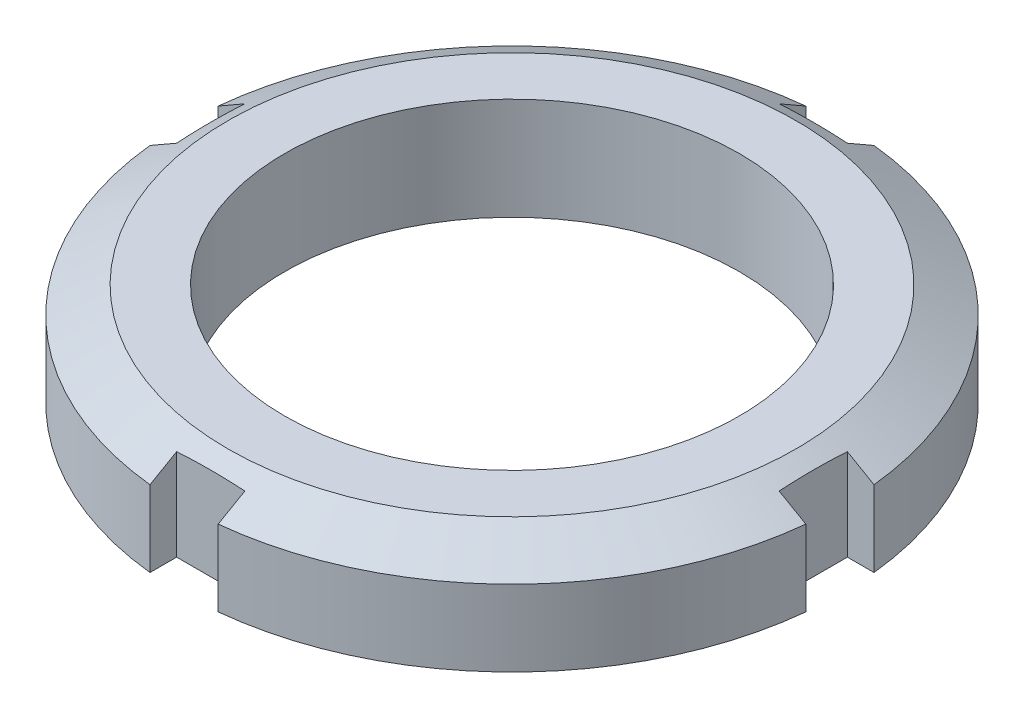
ISO-10303-21;
HEADER;
FILE_DESCRIPTION(('STEP AP214'),'2;1');
FILE_NAME('part.step','',(''),(''),'','','');
FILE_SCHEMA(('AUTOMOTIVE_DESIGN { 1 0 10303 214 1 1 1 1 }'));
ENDSEC;
DATA;
#1=APPLICATION_CONTEXT('core data for automotive mechanical design processes');
#2=APPLICATION_PROTOCOL_DEFINITION('international standard','automotive_design',2000,#1);
#3=PRODUCT_CONTEXT('',#1,'mechanical');
#4=PRODUCT('Part','Part','',(#3));
#5=PRODUCT_RELATED_PRODUCT_CATEGORY('part','',(#4));
#6=PRODUCT_DEFINITION_FORMATION('','',#4);
#7=PRODUCT_DEFINITION_CONTEXT('part definition',#1,'design');
#8=PRODUCT_DEFINITION('design','',#6,#7);
#9=PRODUCT_DEFINITION_SHAPE('','',#8);
#10=(LENGTH_UNIT() NAMED_UNIT(*) SI_UNIT(.MILLI.,.METRE.));
#11=(NAMED_UNIT(*) PLANE_ANGLE_UNIT() SI_UNIT($,.RADIAN.));
#12=(NAMED_UNIT(*) SI_UNIT($,.STERADIAN.) SOLID_ANGLE_UNIT());
#13=UNCERTAINTY_MEASURE_WITH_UNIT(LENGTH_MEASURE(1.E-05),#10,'distance_accuracy_value','');
#14=(GEOMETRIC_REPRESENTATION_CONTEXT(3) GLOBAL_UNCERTAINTY_ASSIGNED_CONTEXT((#13)) GLOBAL_UNIT_ASSIGNED_CONTEXT((#10,
#11,#12)) REPRESENTATION_CONTEXT('',''));
#15=CARTESIAN_POINT('',(0.,0.,0.));
#16=DIRECTION('',(0.,0.,1.));
#17=DIRECTION('',(1.,0.,0.));
#18=AXIS2_PLACEMENT_3D('',#15,#16,#17);
#19=CARTESIAN_POINT('',(0.,9.,0.));
#20=DIRECTION('',(0.,-1.,0.));
#21=DIRECTION('',(0.,0.,-1.));
#22=AXIS2_PLACEMENT_3D('',#19,#20,#21);
#23=CYLINDRICAL_SURFACE('',#22,29.);
#24=DIRECTION('',(0.,-1.,0.));
#25=VECTOR('',#24,1.);
#26=CARTESIAN_POINT('',(-3.,9.,28.8444102037119));
#27=LINE('',#26,#25);
#28=CARTESIAN_POINT('',(-3.,6.69059892324153,28.8444102037119));
#29=VERTEX_POINT('',#28);
#30=CARTESIAN_POINT('',(-3.,0.,28.8444102037119));
#31=VERTEX_POINT('',#30);
#32=EDGE_CURVE('E177',#29,#31,#27,.T.);
#33=ORIENTED_EDGE('',*,*,#32,.F.);
#34=CARTESIAN_POINT('',(0.,6.69059892324153,0.));
#35=DIRECTION('',(0.,1.,0.));
#36=DIRECTION('',(0.,0.,1.));
#37=AXIS2_PLACEMENT_3D('',#34,#35,#36);
#38=CIRCLE('',#37,29.);
#39=CARTESIAN_POINT('',(-28.8444102037119,6.69059892324153,3.));
#40=VERTEX_POINT('',#39);
#41=EDGE_CURVE('E173',#40,#29,#38,.T.);
#42=ORIENTED_EDGE('',*,*,#41,.F.);
#43=DIRECTION('',(0.,-1.,0.));
#44=VECTOR('',#43,1.);
#45=CARTESIAN_POINT('',(-28.8444102037119,9.,3.));
#46=LINE('',#45,#44);
#47=CARTESIAN_POINT('',(-28.8444102037119,0.,3.));
#48=VERTEX_POINT('',#47);
#49=EDGE_CURVE('E392',#48,#40,#46,.F.);
#50=ORIENTED_EDGE('',*,*,#49,.F.);
#51=CARTESIAN_POINT('',(0.,0.,0.));
#52=DIRECTION('',(0.,1.,0.));
#53=DIRECTION('',(0.,0.,1.));
#54=AXIS2_PLACEMENT_3D('',#51,#52,#53);
#55=CIRCLE('',#54,29.);
#56=EDGE_CURVE('E224',#48,#31,#55,.T.);
#57=ORIENTED_EDGE('',*,*,#56,.T.);
#58=EDGE_LOOP('',(#33,#42,#50,#57));
#59=FACE_BOUND('',#58,.T.);
#60=ADVANCED_FACE('F35',(#59),#23,.T.);
#61=DIRECTION('',(0.,-1.,0.));
#62=VECTOR('',#61,1.);
#63=CARTESIAN_POINT('',(3.,9.,-28.8444102037119));
#64=LINE('',#63,#62);
#65=CARTESIAN_POINT('',(3.,6.69059892324153,-28.8444102037119));
#66=VERTEX_POINT('',#65);
#67=CARTESIAN_POINT('',(3.,0.,-28.8444102037119));
#68=VERTEX_POINT('',#67);
#69=EDGE_CURVE('E197',#66,#68,#64,.T.);
#70=ORIENTED_EDGE('',*,*,#69,.F.);
#71=CARTESIAN_POINT('',(28.8444102037119,6.69059892324153,-3.));
#72=VERTEX_POINT('',#71);
#73=EDGE_CURVE('E171',#72,#66,#38,.T.);
#74=ORIENTED_EDGE('',*,*,#73,.F.);
#75=DIRECTION('',(0.,-1.,0.));
#76=VECTOR('',#75,1.);
#77=CARTESIAN_POINT('',(28.8444102037119,9.,-3.));
#78=LINE('',#77,#76);
#79=CARTESIAN_POINT('',(28.8444102037119,0.,-3.));
#80=VERTEX_POINT('',#79);
#81=EDGE_CURVE('E239',#80,#72,#78,.F.);
#82=ORIENTED_EDGE('',*,*,#81,.F.);
#83=EDGE_CURVE('E221',#80,#68,#55,.T.);
#84=ORIENTED_EDGE('',*,*,#83,.T.);
#85=EDGE_LOOP('',(#70,#74,#82,#84));
#86=FACE_BOUND('',#85,.T.);
#87=ADVANCED_FACE('F236',(#86),#23,.T.);
#88=DIRECTION('',(0.,-1.,0.));
#89=VECTOR('',#88,1.);
#90=CARTESIAN_POINT('',(-28.8444102037119,9.,-3.));
#91=LINE('',#90,#89);
#92=CARTESIAN_POINT('',(-28.8444102037119,6.69059892324153,-3.));
#93=VERTEX_POINT('',#92);
#94=CARTESIAN_POINT('',(-28.8444102037119,0.,-3.));
#95=VERTEX_POINT('',#94);
#96=EDGE_CURVE('E61',#93,#95,#91,.T.);
#97=ORIENTED_EDGE('',*,*,#96,.F.);
#98=CARTESIAN_POINT('',(-3.,6.69059892324153,-28.8444102037119));
#99=VERTEX_POINT('',#98);
#100=EDGE_CURVE('E55',#99,#93,#38,.T.);
#101=ORIENTED_EDGE('',*,*,#100,.F.);
#102=DIRECTION('',(0.,-1.,0.));
#103=VECTOR('',#102,1.);
#104=CARTESIAN_POINT('',(-3.,9.,-28.8444102037119));
#105=LINE('',#104,#103);
#106=CARTESIAN_POINT('',(-3.,0.,-28.8444102037119));
#107=VERTEX_POINT('',#106);
#108=EDGE_CURVE('E200',#107,#99,#105,.F.);
#109=ORIENTED_EDGE('',*,*,#108,.F.);
#110=EDGE_CURVE('E48',#107,#95,#55,.T.);
#111=ORIENTED_EDGE('',*,*,#110,.T.);
#112=EDGE_LOOP('',(#97,#101,#109,#111));
#113=FACE_BOUND('',#112,.T.);
#114=ADVANCED_FACE('F374',(#113),#23,.T.);
#115=CARTESIAN_POINT('',(0.,9.,0.));
#116=DIRECTION('',(0.,1.,0.));
#117=DIRECTION('',(0.,0.,1.));
#118=AXIS2_PLACEMENT_3D('',#115,#116,#117);
#119=PLANE('',#118);
#120=CARTESIAN_POINT('',(0.,9.,0.));
#121=DIRECTION('',(0.,1.,0.));
#122=DIRECTION('',(0.,0.,1.));
#123=AXIS2_PLACEMENT_3D('',#120,#121,#122);
#124=CIRCLE('',#123,25.);
#125=CARTESIAN_POINT('',(0.,9.,25.));
#126=VERTEX_POINT('',#125);
#127=EDGE_CURVE('E170',#126,#126,#124,.T.);
#128=ORIENTED_EDGE('',*,*,#127,.T.);
#129=EDGE_LOOP('',(#128));
#130=FACE_BOUND('',#129,.T.);
#131=CARTESIAN_POINT('',(0.,9.,0.));
#132=DIRECTION('',(0.,1.,0.));
#133=DIRECTION('',(0.,0.,1.));
#134=AXIS2_PLACEMENT_3D('',#131,#132,#133);
#135=CIRCLE('',#134,20.);
#136=CARTESIAN_POINT('',(0.,9.,20.));
#137=VERTEX_POINT('',#136);
#138=EDGE_CURVE('E218',#137,#137,#135,.T.);
#139=ORIENTED_EDGE('',*,*,#138,.F.);
#140=EDGE_LOOP('',(#139));
#141=FACE_BOUND('',#140,.T.);
#142=ADVANCED_FACE('F385',(#130,#141),#119,.T.);
#143=CARTESIAN_POINT('',(0.,0.,0.));
#144=DIRECTION('',(0.,1.,0.));
#145=DIRECTION('',(0.,0.,1.));
#146=AXIS2_PLACEMENT_3D('',#143,#144,#145);
#147=PLANE('',#146);
#148=ORIENTED_EDGE('',*,*,#56,.F.);
#149=DIRECTION('',(-1.,0.,0.));
#150=VECTOR('',#149,1.);
#151=CARTESIAN_POINT('',(-26.5,0.,3.));
#152=LINE('',#151,#150);
#153=CARTESIAN_POINT('',(-26.5,0.,3.));
#154=VERTEX_POINT('',#153);
#155=EDGE_CURVE('E399',#154,#48,#152,.T.);
#156=ORIENTED_EDGE('',*,*,#155,.F.);
#157=DIRECTION('',(0.,0.,1.));
#158=VECTOR('',#157,1.);
#159=CARTESIAN_POINT('',(-26.5,0.,3.));
#160=LINE('',#159,#158);
#161=CARTESIAN_POINT('',(-26.5,0.,-3.));
#162=VERTEX_POINT('',#161);
#163=EDGE_CURVE('E394',#162,#154,#160,.T.);
#164=ORIENTED_EDGE('',*,*,#163,.F.);
#165=DIRECTION('',(1.,0.,0.));
#166=VECTOR('',#165,1.);
#167=CARTESIAN_POINT('',(-26.5,0.,-3.));
#168=LINE('',#167,#166);
#169=EDGE_CURVE('E405',#95,#162,#168,.T.);
#170=ORIENTED_EDGE('',*,*,#169,.F.);
#171=ORIENTED_EDGE('',*,*,#110,.F.);
#172=DIRECTION('',(0.,0.,-1.));
#173=VECTOR('',#172,1.);
#174=CARTESIAN_POINT('',(-3.,0.,-29.));
#175=LINE('',#174,#173);
#176=CARTESIAN_POINT('',(-3.,0.,-26.5));
#177=VERTEX_POINT('',#176);
#178=EDGE_CURVE('E206',#177,#107,#175,.T.);
#179=ORIENTED_EDGE('',*,*,#178,.F.);
#180=DIRECTION('',(-1.,0.,0.));
#181=VECTOR('',#180,1.);
#182=CARTESIAN_POINT('',(-3.,0.,-26.5));
#183=LINE('',#182,#181);
#184=CARTESIAN_POINT('',(3.,0.,-26.5));
#185=VERTEX_POINT('',#184);
#186=EDGE_CURVE('E212',#185,#177,#183,.T.);
#187=ORIENTED_EDGE('',*,*,#186,.F.);
#188=DIRECTION('',(0.,0.,1.));
#189=VECTOR('',#188,1.);
#190=CARTESIAN_POINT('',(3.,0.,-29.));
#191=LINE('',#190,#189);
#192=EDGE_CURVE('E203',#68,#185,#191,.T.);
#193=ORIENTED_EDGE('',*,*,#192,.F.);
#194=ORIENTED_EDGE('',*,*,#83,.F.);
#195=DIRECTION('',(1.,0.,0.));
#196=VECTOR('',#195,1.);
#197=CARTESIAN_POINT('',(26.5,0.,-3.));
#198=LINE('',#197,#196);
#199=CARTESIAN_POINT('',(26.5,0.,-3.));
#200=VERTEX_POINT('',#199);
#201=EDGE_CURVE('E413',#200,#80,#198,.T.);
#202=ORIENTED_EDGE('',*,*,#201,.F.);
#203=DIRECTION('',(0.,0.,-1.));
#204=VECTOR('',#203,1.);
#205=CARTESIAN_POINT('',(26.5,0.,-3.));
#206=LINE('',#205,#204);
#207=CARTESIAN_POINT('',(26.5,0.,3.));
#208=VERTEX_POINT('',#207);
#209=EDGE_CURVE('E410',#208,#200,#206,.T.);
#210=ORIENTED_EDGE('',*,*,#209,.F.);
#211=DIRECTION('',(-1.,0.,0.));
#212=VECTOR('',#211,1.);
#213=CARTESIAN_POINT('',(26.5,0.,3.));
#214=LINE('',#213,#212);
#215=CARTESIAN_POINT('',(28.8444102037119,0.,3.));
#216=VERTEX_POINT('',#215);
#217=EDGE_CURVE('E178',#216,#208,#214,.T.);
#218=ORIENTED_EDGE('',*,*,#217,.F.);
#219=CARTESIAN_POINT('',(3.,0.,28.8444102037119));
#220=VERTEX_POINT('',#219);
#221=EDGE_CURVE('E225',#220,#216,#55,.T.);
#222=ORIENTED_EDGE('',*,*,#221,.F.);
#223=DIRECTION('',(0.,0.,1.));
#224=VECTOR('',#223,1.);
#225=CARTESIAN_POINT('',(3.,0.,26.5));
#226=LINE('',#225,#224);
#227=CARTESIAN_POINT('',(3.,0.,26.5));
#228=VERTEX_POINT('',#227);
#229=EDGE_CURVE('E176',#228,#220,#226,.T.);
#230=ORIENTED_EDGE('',*,*,#229,.F.);
#231=DIRECTION('',(1.,0.,0.));
#232=VECTOR('',#231,1.);
#233=CARTESIAN_POINT('',(-3.,0.,26.5));
#234=LINE('',#233,#232);
#235=CARTESIAN_POINT('',(-3.,0.,26.5));
#236=VERTEX_POINT('',#235);
#237=EDGE_CURVE('E187',#236,#228,#234,.T.);
#238=ORIENTED_EDGE('',*,*,#237,.F.);
#239=DIRECTION('',(0.,0.,-1.));
#240=VECTOR('',#239,1.);
#241=CARTESIAN_POINT('',(-3.,0.,26.5));
#242=LINE('',#241,#240);
#243=EDGE_CURVE('E190',#31,#236,#242,.T.);
#244=ORIENTED_EDGE('',*,*,#243,.F.);
#245=EDGE_LOOP('',(#148,#156,#164,#170,#171,#179,#187,#193,#194,#202,#210,#218,#222,#230,#238,#244));
#246=FACE_BOUND('',#245,.T.);
#247=CARTESIAN_POINT('',(0.,0.,0.));
#248=DIRECTION('',(0.,1.,0.));
#249=DIRECTION('',(0.,0.,1.));
#250=AXIS2_PLACEMENT_3D('',#247,#248,#249);
#251=CIRCLE('',#250,20.);
#252=CARTESIAN_POINT('',(0.,0.,20.));
#253=VERTEX_POINT('',#252);
#254=EDGE_CURVE('E217',#253,#253,#251,.T.);
#255=ORIENTED_EDGE('',*,*,#254,.T.);
#256=EDGE_LOOP('',(#255));
#257=FACE_BOUND('',#256,.T.);
#258=ADVANCED_FACE('F244',(#246,#257),#147,.F.);
#259=DIRECTION('',(0.,-1.,0.));
#260=VECTOR('',#259,1.);
#261=CARTESIAN_POINT('',(28.8444102037119,9.,3.));
#262=LINE('',#261,#260);
#263=CARTESIAN_POINT('',(28.8444102037119,6.69059892324153,3.));
#264=VERTEX_POINT('',#263);
#265=EDGE_CURVE('E169',#264,#216,#262,.T.);
#266=ORIENTED_EDGE('',*,*,#265,.F.);
#267=CARTESIAN_POINT('',(3.,6.69059892324153,28.8444102037119));
#268=VERTEX_POINT('',#267);
#269=EDGE_CURVE('E154',#268,#264,#38,.T.);
#270=ORIENTED_EDGE('',*,*,#269,.F.);
#271=DIRECTION('',(0.,-1.,0.));
#272=VECTOR('',#271,1.);
#273=CARTESIAN_POINT('',(3.,9.,28.8444102037119));
#274=LINE('',#273,#272);
#275=EDGE_CURVE('E167',#220,#268,#274,.F.);
#276=ORIENTED_EDGE('',*,*,#275,.F.);
#277=ORIENTED_EDGE('',*,*,#221,.T.);
#278=EDGE_LOOP('',(#266,#270,#276,#277));
#279=FACE_BOUND('',#278,.T.);
#280=ADVANCED_FACE('F37',(#279),#23,.T.);
#281=CARTESIAN_POINT('',(0.,9.,0.));
#282=DIRECTION('',(0.,-1.,0.));
#283=DIRECTION('',(0.,0.,-1.));
#284=AXIS2_PLACEMENT_3D('',#281,#282,#283);
#285=CYLINDRICAL_SURFACE('',#284,20.);
#286=ORIENTED_EDGE('',*,*,#138,.T.);
#287=EDGE_LOOP('',(#286));
#288=FACE_BOUND('',#287,.T.);
#289=ORIENTED_EDGE('',*,*,#254,.F.);
#290=EDGE_LOOP('',(#289));
#291=FACE_BOUND('',#290,.T.);
#292=ADVANCED_FACE('F377',(#288,#291),#285,.F.);
#293=CARTESIAN_POINT('',(-3.,-0.000999999999999265,-29.));
#294=DIRECTION('',(-1.,0.,0.));
#295=DIRECTION('',(0.,0.,1.));
#296=AXIS2_PLACEMENT_3D('',#293,#294,#295);
#297=PLANE('',#296);
#298=ORIENTED_EDGE('',*,*,#108,.T.);
#299=CARTESIAN_POINT('',(-3.,3.92751956717149,-33.6523381762277));
#300=CARTESIAN_POINT('',(-3.,4.42131510398871,-32.7936596757044));
#301=CARTESIAN_POINT('',(-3.,4.91500534536485,-31.9349205971219));
#302=CARTESIAN_POINT('',(-3.,5.90209977080451,-30.2172782791755));
#303=CARTESIAN_POINT('',(-3.,6.39550395492437,-29.358375039844));
#304=CARTESIAN_POINT('',(-3.,7.38195104144227,-27.6403609748876));
#305=CARTESIAN_POINT('',(-3.,7.87499394380557,-26.7812501492428));
#306=CARTESIAN_POINT('',(-3.,8.8605876956878,-25.0627460857465));
#307=CARTESIAN_POINT('',(-3.,9.35313854510872,-24.2033528478388));
#308=CARTESIAN_POINT('',(-3.,9.84537790801721,-23.3437811206322));
#309=B_SPLINE_CURVE_WITH_KNOTS('',3,(#299,#300,#301,#302,#303,#304,#305,#306,#307,#308),
.UNSPECIFIED.,.F.,.F.,(4,2,2,2,4),(0.,2.97160988952772,5.9432191937294,8.91482878371123,
11.886438965506),.UNSPECIFIED.);
#310=CARTESIAN_POINT('',(-3.,8.03624610843134,-26.5));
#311=VERTEX_POINT('',#310);
#312=EDGE_CURVE('E252',#99,#311,#309,.T.);
#313=ORIENTED_EDGE('',*,*,#312,.T.);
#314=DIRECTION('',(0.,1.,0.));
#315=VECTOR('',#314,1.);
#316=CARTESIAN_POINT('',(-3.,-0.000999999999999265,-26.5));
#317=LINE('',#316,#315);
#318=EDGE_CURVE('E208',#177,#311,#317,.T.);
#319=ORIENTED_EDGE('',*,*,#318,.F.);
#320=ORIENTED_EDGE('',*,*,#178,.T.);
#321=EDGE_LOOP('',(#298,#313,#319,#320));
#322=FACE_BOUND('',#321,.T.);
#323=ADVANCED_FACE('F382',(#322),#297,.F.);
#324=CARTESIAN_POINT('',(3.,-0.000999999999999265,-29.));
#325=DIRECTION('',(1.,0.,0.));
#326=DIRECTION('',(0.,0.,-1.));
#327=AXIS2_PLACEMENT_3D('',#324,#325,#326);
#328=PLANE('',#327);
#329=DIRECTION('',(0.,1.,0.));
#330=VECTOR('',#329,1.);
#331=CARTESIAN_POINT('',(3.,-0.000999999999999265,-26.5));
#332=LINE('',#331,#330);
#333=CARTESIAN_POINT('',(3.,8.03624610843134,-26.5));
#334=VERTEX_POINT('',#333);
#335=EDGE_CURVE('E209',#185,#334,#332,.T.);
#336=ORIENTED_EDGE('',*,*,#335,.T.);
#337=CARTESIAN_POINT('',(3.,9.84537790801721,-23.3437811206322));
#338=CARTESIAN_POINT('',(3.,9.35313854510872,-24.2033528478388));
#339=CARTESIAN_POINT('',(3.,8.8605876956878,-25.0627460857465));
#340=CARTESIAN_POINT('',(3.,7.87499394380557,-26.7812501492428));
#341=CARTESIAN_POINT('',(3.,7.38195104144227,-27.6403609748876));
#342=CARTESIAN_POINT('',(3.,6.39550395492436,-29.358375039844));
#343=CARTESIAN_POINT('',(3.,5.90209977080451,-30.2172782791755));
#344=CARTESIAN_POINT('',(3.,4.91500534536485,-31.9349205971219));
#345=CARTESIAN_POINT('',(3.,4.42131510398871,-32.7936596757044));
#346=CARTESIAN_POINT('',(3.,3.92751956717148,-33.6523381762277));
#347=B_SPLINE_CURVE_WITH_KNOTS('',3,(#337,#338,#339,#340,#341,#342,#343,#344,#345,#346),
.UNSPECIFIED.,.F.,.F.,(4,2,2,2,4),(0.,2.97161018179478,5.94321977177662,8.91482907597829,
11.886438965506),.UNSPECIFIED.);
#348=EDGE_CURVE('E250',#334,#66,#347,.T.);
#349=ORIENTED_EDGE('',*,*,#348,.T.);
#350=ORIENTED_EDGE('',*,*,#69,.T.);
#351=ORIENTED_EDGE('',*,*,#192,.T.);
#352=EDGE_LOOP('',(#336,#349,#350,#351));
#353=FACE_BOUND('',#352,.T.);
#354=ADVANCED_FACE('F248',(#353),#328,.F.);
#355=CARTESIAN_POINT('',(-3.,-0.000999999999999265,-26.5));
#356=DIRECTION('',(0.,0.,1.));
#357=DIRECTION('',(1.,0.,0.));
#358=AXIS2_PLACEMENT_3D('',#355,#356,#357);
#359=PLANE('',#358);
#360=ORIENTED_EDGE('',*,*,#318,.T.);
#361=CARTESIAN_POINT('',(-14.9988367405271,5.85332154770774,-26.5));
#362=CARTESIAN_POINT('',(-13.9525970902678,6.15087384790108,-26.5));
#363=CARTESIAN_POINT('',(-12.8995558952418,6.42677860890727,-26.5));
#364=CARTESIAN_POINT('',(-10.7796243397786,6.92604365132795,-26.5));
#365=CARTESIAN_POINT('',(-9.71271678933867,7.14933048853316,-26.5));
#366=CARTESIAN_POINT('',(-8.11295270220856,7.43564768166331,-26.5));
#367=CARTESIAN_POINT('',(-7.58433694855219,7.52244079843687,-26.5));
#368=CARTESIAN_POINT('',(-6.52471239992944,7.6798168670045,-26.5));
#369=CARTESIAN_POINT('',(-5.99370373523887,7.75040069065528,-26.5));
#370=CARTESIAN_POINT('',(-4.92996679924756,7.87437186343035,-26.5));
#371=CARTESIAN_POINT('',(-4.39723961522318,7.92776850677642,-26.5));
#372=CARTESIAN_POINT('',(-3.33028813357606,8.01664309714429,-26.5));
#373=CARTESIAN_POINT('',(-2.79606384350218,8.05212113435418,-26.5));
#374=CARTESIAN_POINT('',(-1.72542093371849,8.10467854293642,-26.5));
#375=CARTESIAN_POINT('',(-1.18900012494798,8.12171354320107,-26.5));
#376=CARTESIAN_POINT('',(-0.115887682938948,8.13696278171401,-26.5));
#377=CARTESIAN_POINT('',(0.420803951357742,8.13517694584645,-26.5));
#378=CARTESIAN_POINT('',(1.49404888615119,8.11280755301326,-26.5));
#379=CARTESIAN_POINT('',(2.03060199944767,8.09221505592009,-26.5));
#380=CARTESIAN_POINT('',(3.10266863247498,8.03254604694341,-26.5));
#381=CARTESIAN_POINT('',(3.6381821628859,7.99346972597192,-26.5));
#382=CARTESIAN_POINT('',(4.71664286320863,7.89661635522389,-26.5));
#383=CARTESIAN_POINT('',(5.25956251301624,7.83853409720274,-26.5));
#384=CARTESIAN_POINT('',(6.34324274672697,7.70473374811867,-26.5));
#385=CARTESIAN_POINT('',(6.88400322146448,7.62901477656423,-26.5));
#386=CARTESIAN_POINT('',(7.96251181703648,7.46104856207199,-26.5));
#387=CARTESIAN_POINT('',(8.50026192711688,7.36881401718704,-26.5));
#388=CARTESIAN_POINT('',(9.57281427352446,7.1689603802395,-26.5));
#389=CARTESIAN_POINT('',(10.1076169564687,7.06134368949857,-26.5));
#390=CARTESIAN_POINT('',(10.64085359719,6.94661259381029,-26.5));
#391=B_SPLINE_CURVE_WITH_KNOTS('',3,(#361,#362,#363,#364,#365,#366,#367,#368,#369,#370,#371,
#372,#373,#374,#375,#376,#377,#378,#379,#380,#381,#382,#383,#384,#385,#386,#387,#388,#389,#390),
.UNSPECIFIED.,.F.,.F.,(4,2,2,2,2,2,2,2,2,2,2,2,2,2,4),(0.,3.26395278277017,6.53243476436697,
8.13929097067566,9.74606072801608,11.3519601353857,12.9578514598468,14.5675977845226,
16.177350448329,17.7878687392209,19.3983703960754,21.036119788587,22.6739509612822,
24.3105282472243,25.9468503239806),.UNSPECIFIED.);
#392=EDGE_CURVE('E253',#311,#334,#391,.T.);
#393=ORIENTED_EDGE('',*,*,#392,.T.);
#394=ORIENTED_EDGE('',*,*,#335,.F.);
#395=ORIENTED_EDGE('',*,*,#186,.T.);
#396=EDGE_LOOP('',(#360,#393,#394,#395));
#397=FACE_BOUND('',#396,.T.);
#398=ADVANCED_FACE('F339',(#397),#359,.F.);
#399=CARTESIAN_POINT('',(-3.,-0.000999999999999265,26.5));
#400=DIRECTION('',(-1.,0.,0.));
#401=DIRECTION('',(0.,0.,1.));
#402=AXIS2_PLACEMENT_3D('',#399,#400,#401);
#403=PLANE('',#402);
#404=DIRECTION('',(0.,1.,0.));
#405=VECTOR('',#404,1.);
#406=CARTESIAN_POINT('',(-3.,-0.000999999999999265,26.5));
#407=LINE('',#406,#405);
#408=CARTESIAN_POINT('',(-3.,8.03624610843134,26.5));
#409=VERTEX_POINT('',#408);
#410=EDGE_CURVE('E194',#236,#409,#407,.T.);
#411=ORIENTED_EDGE('',*,*,#410,.T.);
#412=CARTESIAN_POINT('',(-3.,10.74561732905,21.7707750058209));
#413=CARTESIAN_POINT('',(-3.,10.2538244049422,22.6306024130696));
#414=CARTESIAN_POINT('',(-3.,9.76165142678239,23.4902122655571));
#415=CARTESIAN_POINT('',(-3.,8.77671211938619,25.2090916764246));
#416=CARTESIAN_POINT('',(-3.,8.28394579031722,26.0683612349004));
#417=CARTESIAN_POINT('',(-3.,7.29798633130924,27.7866552347157));
#418=CARTESIAN_POINT('',(-3.,6.80479320143152,28.6456796760903));
#419=CARTESIAN_POINT('',(-3.,5.81807276674447,30.3635369380255));
#420=CARTESIAN_POINT('',(-3.,5.32454546184215,31.2223697585328));
#421=CARTESIAN_POINT('',(-3.,4.83089755506785,32.0811332159282));
#422=B_SPLINE_CURVE_WITH_KNOTS('',3,(#412,#413,#414,#415,#416,#417,#418,#419,#420,#421),
.UNSPECIFIED.,.F.,.F.,(4,2,2,2,4),(0.,2.97161053683262,5.94322023552311,8.9148295075205,
11.8864396067851),.UNSPECIFIED.);
#423=EDGE_CURVE('E257',#409,#29,#422,.T.);
#424=ORIENTED_EDGE('',*,*,#423,.T.);
#425=ORIENTED_EDGE('',*,*,#32,.T.);
#426=ORIENTED_EDGE('',*,*,#243,.T.);
#427=EDGE_LOOP('',(#411,#424,#425,#426));
#428=FACE_BOUND('',#427,.T.);
#429=ADVANCED_FACE('F335',(#428),#403,.F.);
#430=CARTESIAN_POINT('',(-3.,-0.000999999999999265,26.5));
#431=DIRECTION('',(0.,0.,-1.));
#432=DIRECTION('',(-1.,0.,0.));
#433=AXIS2_PLACEMENT_3D('',#430,#431,#432);
#434=PLANE('',#433);
#435=DIRECTION('',(0.,1.,0.));
#436=VECTOR('',#435,1.);
#437=CARTESIAN_POINT('',(3.,-0.000999999999999265,26.5));
#438=LINE('',#437,#436);
#439=CARTESIAN_POINT('',(3.,8.03624610843134,26.5));
#440=VERTEX_POINT('',#439);
#441=EDGE_CURVE('E193',#228,#440,#438,.T.);
#442=ORIENTED_EDGE('',*,*,#441,.T.);
#443=CARTESIAN_POINT('',(10.64085359719,6.94661259381029,26.5));
#444=CARTESIAN_POINT('',(10.1076169564687,7.06134368949857,26.5));
#445=CARTESIAN_POINT('',(9.57281427352446,7.1689603802395,26.5));
#446=CARTESIAN_POINT('',(8.50026192711689,7.36881401718704,26.5));
#447=CARTESIAN_POINT('',(7.96251181703648,7.46104856207199,26.5));
#448=CARTESIAN_POINT('',(6.88400322146449,7.62901477656423,26.5));
#449=CARTESIAN_POINT('',(6.34324274672697,7.70473374811867,26.5));
#450=CARTESIAN_POINT('',(5.25956251301625,7.83853409720274,26.5));
#451=CARTESIAN_POINT('',(4.71664286320864,7.89661635522389,26.5));
#452=CARTESIAN_POINT('',(3.63818216288591,7.99346972597192,26.5));
#453=CARTESIAN_POINT('',(3.10266863247499,8.03254604694341,26.5));
#454=CARTESIAN_POINT('',(2.03060199944767,8.09221505592009,26.5));
#455=CARTESIAN_POINT('',(1.4940488861512,8.11280755301326,26.5));
#456=CARTESIAN_POINT('',(0.420803951357749,8.13517694584645,26.5));
#457=CARTESIAN_POINT('',(-0.11588768293894,8.13696278171401,26.5));
#458=CARTESIAN_POINT('',(-1.18900012494797,8.12171354320107,26.5));
#459=CARTESIAN_POINT('',(-1.72542093371849,8.10467854293642,26.5));
#460=CARTESIAN_POINT('',(-2.79606384350218,8.05212113435418,26.5));
#461=CARTESIAN_POINT('',(-3.33028813357605,8.01664309714429,26.5));
#462=CARTESIAN_POINT('',(-4.39723961522317,7.92776850677642,26.5));
#463=CARTESIAN_POINT('',(-4.92996679924756,7.87437186343035,26.5));
#464=CARTESIAN_POINT('',(-5.99370373523886,7.75040069065528,26.5));
#465=CARTESIAN_POINT('',(-6.52471239992943,7.6798168670045,26.5));
#466=CARTESIAN_POINT('',(-7.58433694855219,7.52244079843687,26.5));
#467=CARTESIAN_POINT('',(-8.11295270220855,7.43564768166331,26.5));
#468=CARTESIAN_POINT('',(-9.71271678933866,7.14933048853316,26.5));
#469=CARTESIAN_POINT('',(-10.7796243397785,6.92604365132795,26.5));
#470=CARTESIAN_POINT('',(-12.8995558952418,6.42677860890727,26.5));
#471=CARTESIAN_POINT('',(-13.9525970902678,6.15087384790108,26.5));
#472=CARTESIAN_POINT('',(-14.9988367405271,5.85332154770774,26.5));
#473=B_SPLINE_CURVE_WITH_KNOTS('',3,(#443,#444,#445,#446,#447,#448,#449,#450,#451,#452,#453,
#454,#455,#456,#457,#458,#459,#460,#461,#462,#463,#464,#465,#466,#467,#468,#469,#470,#471,#472),
.UNSPECIFIED.,.F.,.F.,(4,2,2,2,2,2,2,2,2,2,2,2,2,2,4),(0.,1.63632207675635,3.27289936269839,
4.91073053539358,6.54847992790517,8.15898158475975,9.76949987565156,11.379252539458,
12.9889988641338,14.5948901885949,16.2007895959645,17.8075593533049,19.4144155596136,
22.6828975412104,25.9468503239806),.UNSPECIFIED.);
#474=EDGE_CURVE('E157',#440,#409,#473,.T.);
#475=ORIENTED_EDGE('',*,*,#474,.T.);
#476=ORIENTED_EDGE('',*,*,#410,.F.);
#477=ORIENTED_EDGE('',*,*,#237,.T.);
#478=EDGE_LOOP('',(#442,#475,#476,#477));
#479=FACE_BOUND('',#478,.T.);
#480=ADVANCED_FACE('F338',(#479),#434,.F.);
#481=CARTESIAN_POINT('',(3.,-0.000999999999999265,26.5));
#482=DIRECTION('',(1.,0.,0.));
#483=DIRECTION('',(0.,0.,-1.));
#484=AXIS2_PLACEMENT_3D('',#481,#482,#483);
#485=PLANE('',#484);
#486=ORIENTED_EDGE('',*,*,#275,.T.);
#487=CARTESIAN_POINT('',(3.,4.83089755506785,32.0811332159282));
#488=CARTESIAN_POINT('',(3.,5.32454546184214,31.2223697585328));
#489=CARTESIAN_POINT('',(3.,5.81807276674446,30.3635369380256));
#490=CARTESIAN_POINT('',(3.,6.8047932014315,28.6456796760903));
#491=CARTESIAN_POINT('',(3.,7.29798633130922,27.7866552347157));
#492=CARTESIAN_POINT('',(3.,8.2839457903172,26.0683612349005));
#493=CARTESIAN_POINT('',(3.,8.77671211938616,25.2090916764246));
#494=CARTESIAN_POINT('',(3.,9.76165142678238,23.4902122655571));
#495=CARTESIAN_POINT('',(3.,10.2538244049422,22.6306024130696));
#496=CARTESIAN_POINT('',(3.,10.74561732905,21.7707750058209));
#497=B_SPLINE_CURVE_WITH_KNOTS('',3,(#487,#488,#489,#490,#491,#492,#493,#494,#495,#496),
.UNSPECIFIED.,.F.,.F.,(4,2,2,2,4),(0.,2.97161009926454,5.94321937126191,8.91482906995243,
11.8864396067851),.UNSPECIFIED.);
#498=EDGE_CURVE('E151',#268,#440,#497,.T.);
#499=ORIENTED_EDGE('',*,*,#498,.T.);
#500=ORIENTED_EDGE('',*,*,#441,.F.);
#501=ORIENTED_EDGE('',*,*,#229,.T.);
#502=EDGE_LOOP('',(#486,#499,#500,#501));
#503=FACE_BOUND('',#502,.T.);
#504=ADVANCED_FACE('F174',(#503),#485,.F.);
#505=CARTESIAN_POINT('',(26.5,-0.000999999999999265,-3.));
#506=DIRECTION('',(-1.,0.,0.));
#507=DIRECTION('',(0.,0.,1.));
#508=AXIS2_PLACEMENT_3D('',#505,#506,#507);
#509=PLANE('',#508);
#510=DIRECTION('',(0.,1.,0.));
#511=VECTOR('',#510,1.);
#512=CARTESIAN_POINT('',(26.5,-0.000999999999999265,-3.));
#513=LINE('',#512,#511);
#514=CARTESIAN_POINT('',(26.5,8.03624610843134,-3.));
#515=VERTEX_POINT('',#514);
#516=EDGE_CURVE('E182',#200,#515,#513,.T.);
#517=ORIENTED_EDGE('',*,*,#516,.T.);
#518=CARTESIAN_POINT('',(26.5,5.85332154770774,-14.9988367405271));
#519=CARTESIAN_POINT('',(26.5,6.15087384790108,-13.9525970902678));
#520=CARTESIAN_POINT('',(26.5,6.42677860890727,-12.8995558952418));
#521=CARTESIAN_POINT('',(26.5,6.92604365132795,-10.7796243397786));
#522=CARTESIAN_POINT('',(26.5,7.14933048853316,-9.71271678933866));
#523=CARTESIAN_POINT('',(26.5,7.43564768166331,-8.11295270220855));
#524=CARTESIAN_POINT('',(26.5,7.52244079843687,-7.58433694855219));
#525=CARTESIAN_POINT('',(26.5,7.6798168670045,-6.52471239992943));
#526=CARTESIAN_POINT('',(26.5,7.75040069065528,-5.99370373523887));
#527=CARTESIAN_POINT('',(26.5,7.87437186343035,-4.92996679924756));
#528=CARTESIAN_POINT('',(26.5,7.92776850677642,-4.39723961522317));
#529=CARTESIAN_POINT('',(26.5,8.01664309714429,-3.33028813357605));
#530=CARTESIAN_POINT('',(26.5,8.05212113435418,-2.79606384350218));
#531=CARTESIAN_POINT('',(26.5,8.10467854293642,-1.72542093371849));
#532=CARTESIAN_POINT('',(26.5,8.12171354320107,-1.18900012494797));
#533=CARTESIAN_POINT('',(26.5,8.13696278171401,-0.115887682938943));
#534=CARTESIAN_POINT('',(26.5,8.13517694584645,0.420803951357746));
#535=CARTESIAN_POINT('',(26.5,8.11280755301326,1.4940488861512));
#536=CARTESIAN_POINT('',(26.5,8.09221505592009,2.03060199944767));
#537=CARTESIAN_POINT('',(26.5,8.03254604694341,3.10266863247499));
#538=CARTESIAN_POINT('',(26.5,7.99346972597192,3.63818216288591));
#539=CARTESIAN_POINT('',(26.5,7.89661635522389,4.71664286320864));
#540=CARTESIAN_POINT('',(26.5,7.83853409720274,5.25956251301625));
#541=CARTESIAN_POINT('',(26.5,7.70473374811867,6.34324274672697));
#542=CARTESIAN_POINT('',(26.5,7.62901477656423,6.88400322146448));
#543=CARTESIAN_POINT('',(26.5,7.46104856207199,7.96251181703648));
#544=CARTESIAN_POINT('',(26.5,7.36881401718704,8.50026192711688));
#545=CARTESIAN_POINT('',(26.5,7.1689603802395,9.57281427352446));
#546=CARTESIAN_POINT('',(26.5,7.06134368949857,10.1076169564687));
#547=CARTESIAN_POINT('',(26.5,6.94661259381029,10.64085359719));
#548=B_SPLINE_CURVE_WITH_KNOTS('',3,(#518,#519,#520,#521,#522,#523,#524,#525,#526,#527,#528,
#529,#530,#531,#532,#533,#534,#535,#536,#537,#538,#539,#540,#541,#542,#543,#544,#545,#546,#547),
.UNSPECIFIED.,.F.,.F.,(4,2,2,2,2,2,2,2,2,2,2,2,2,2,4),(0.,3.26395278277017,6.53243476436697,
8.13929097067566,9.74606072801608,11.3519601353857,12.9578514598468,14.5675977845226,
16.177350448329,17.7878687392209,19.3983703960754,21.036119788587,22.6739509612822,
24.3105282472243,25.9468503239806),.UNSPECIFIED.);
#549=CARTESIAN_POINT('',(26.5,8.03624610843134,3.));
#550=VERTEX_POINT('',#549);
#551=EDGE_CURVE('E308',#515,#550,#548,.T.);
#552=ORIENTED_EDGE('',*,*,#551,.T.);
#553=DIRECTION('',(0.,1.,0.));
#554=VECTOR('',#553,1.);
#555=CARTESIAN_POINT('',(26.5,-0.000999999999999265,3.));
#556=LINE('',#555,#554);
#557=EDGE_CURVE('E415',#208,#550,#556,.T.);
#558=ORIENTED_EDGE('',*,*,#557,.F.);
#559=ORIENTED_EDGE('',*,*,#209,.T.);
#560=EDGE_LOOP('',(#517,#552,#558,#559));
#561=FACE_BOUND('',#560,.T.);
#562=ADVANCED_FACE('F343',(#561),#509,.F.);
#563=CARTESIAN_POINT('',(26.5,-0.000999999999999265,-3.));
#564=DIRECTION('',(0.,0.,-1.));
#565=DIRECTION('',(-1.,0.,0.));
#566=AXIS2_PLACEMENT_3D('',#563,#564,#565);
#567=PLANE('',#566);
#568=ORIENTED_EDGE('',*,*,#81,.T.);
#569=CARTESIAN_POINT('',(32.0811332159282,4.83089755506785,-3.));
#570=CARTESIAN_POINT('',(31.2223697585328,5.32454546184214,-3.));
#571=CARTESIAN_POINT('',(30.3635369380256,5.81807276674446,-3.));
#572=CARTESIAN_POINT('',(28.6456796760903,6.8047932014315,-3.));
#573=CARTESIAN_POINT('',(27.7866552347157,7.29798633130922,-3.));
#574=CARTESIAN_POINT('',(26.0683612349005,8.2839457903172,-3.));
#575=CARTESIAN_POINT('',(25.2090916764246,8.77671211938616,-3.));
#576=CARTESIAN_POINT('',(23.4902122655571,9.76165142678238,-3.));
#577=CARTESIAN_POINT('',(22.6306024130696,10.2538244049422,-3.));
#578=CARTESIAN_POINT('',(21.7707750058209,10.74561732905,-3.));
#579=B_SPLINE_CURVE_WITH_KNOTS('',3,(#569,#570,#571,#572,#573,#574,#575,#576,#577,#578),
.UNSPECIFIED.,.F.,.F.,(4,2,2,2,4),(0.,2.97161009926454,5.94321937126191,8.91482906995242,
11.8864396067851),.UNSPECIFIED.);
#580=EDGE_CURVE('E161',#72,#515,#579,.T.);
#581=ORIENTED_EDGE('',*,*,#580,.T.);
#582=ORIENTED_EDGE('',*,*,#516,.F.);
#583=ORIENTED_EDGE('',*,*,#201,.T.);
#584=EDGE_LOOP('',(#568,#581,#582,#583));
#585=FACE_BOUND('',#584,.T.);
#586=ADVANCED_FACE('F349',(#585),#567,.F.);
#587=CARTESIAN_POINT('',(26.5,-0.000999999999999265,3.));
#588=DIRECTION('',(0.,0.,1.));
#589=DIRECTION('',(1.,0.,0.));
#590=AXIS2_PLACEMENT_3D('',#587,#588,#589);
#591=PLANE('',#590);
#592=ORIENTED_EDGE('',*,*,#557,.T.);
#593=CARTESIAN_POINT('',(21.7707750058209,10.74561732905,3.));
#594=CARTESIAN_POINT('',(22.6306024130696,10.2538244049422,3.));
#595=CARTESIAN_POINT('',(23.4902122655571,9.76165142678238,3.));
#596=CARTESIAN_POINT('',(25.2090916764246,8.77671211938616,3.));
#597=CARTESIAN_POINT('',(26.0683612349005,8.2839457903172,3.));
#598=CARTESIAN_POINT('',(27.7866552347157,7.29798633130922,3.));
#599=CARTESIAN_POINT('',(28.6456796760903,6.8047932014315,3.));
#600=CARTESIAN_POINT('',(30.3635369380256,5.81807276674446,3.));
#601=CARTESIAN_POINT('',(31.2223697585328,5.32454546184214,3.));
#602=CARTESIAN_POINT('',(32.0811332159282,4.83089755506785,3.));
#603=B_SPLINE_CURVE_WITH_KNOTS('',3,(#593,#594,#595,#596,#597,#598,#599,#600,#601,#602),
.UNSPECIFIED.,.F.,.F.,(4,2,2,2,4),(0.,2.97161053683265,5.94322023552316,8.91482950752053,
11.8864396067851),.UNSPECIFIED.);
#604=EDGE_CURVE('E301',#550,#264,#603,.T.);
#605=ORIENTED_EDGE('',*,*,#604,.T.);
#606=ORIENTED_EDGE('',*,*,#265,.T.);
#607=ORIENTED_EDGE('',*,*,#217,.T.);
#608=EDGE_LOOP('',(#592,#605,#606,#607));
#609=FACE_BOUND('',#608,.T.);
#610=ADVANCED_FACE('F351',(#609),#591,.F.);
#611=CARTESIAN_POINT('',(-26.5,-0.000999999999999265,3.));
#612=DIRECTION('',(1.,0.,0.));
#613=DIRECTION('',(0.,0.,-1.));
#614=AXIS2_PLACEMENT_3D('',#611,#612,#613);
#615=PLANE('',#614);
#616=DIRECTION('',(0.,1.,0.));
#617=VECTOR('',#616,1.);
#618=CARTESIAN_POINT('',(-26.5,-0.000999999999999265,3.));
#619=LINE('',#618,#617);
#620=CARTESIAN_POINT('',(-26.5,8.03624610843134,3.));
#621=VERTEX_POINT('',#620);
#622=EDGE_CURVE('E402',#154,#621,#619,.T.);
#623=ORIENTED_EDGE('',*,*,#622,.T.);
#624=CARTESIAN_POINT('',(-26.5,6.94661259381029,10.64085359719));
#625=CARTESIAN_POINT('',(-26.5,7.06134368949857,10.1076169564687));
#626=CARTESIAN_POINT('',(-26.5,7.1689603802395,9.57281427352446));
#627=CARTESIAN_POINT('',(-26.5,7.36881401718704,8.50026192711689));
#628=CARTESIAN_POINT('',(-26.5,7.46104856207199,7.96251181703648));
#629=CARTESIAN_POINT('',(-26.5,7.62901477656423,6.88400322146449));
#630=CARTESIAN_POINT('',(-26.5,7.70473374811867,6.34324274672697));
#631=CARTESIAN_POINT('',(-26.5,7.83853409720274,5.25956251301625));
#632=CARTESIAN_POINT('',(-26.5,7.89661635522389,4.71664286320864));
#633=CARTESIAN_POINT('',(-26.5,7.99346972597192,3.63818216288591));
#634=CARTESIAN_POINT('',(-26.5,8.03254604694341,3.10266863247499));
#635=CARTESIAN_POINT('',(-26.5,8.09221505592009,2.03060199944767));
#636=CARTESIAN_POINT('',(-26.5,8.11280755301326,1.4940488861512));
#637=CARTESIAN_POINT('',(-26.5,8.13517694584645,0.420803951357749));
#638=CARTESIAN_POINT('',(-26.5,8.13696278171401,-0.11588768293894));
#639=CARTESIAN_POINT('',(-26.5,8.12171354320107,-1.18900012494797));
#640=CARTESIAN_POINT('',(-26.5,8.10467854293642,-1.72542093371849));
#641=CARTESIAN_POINT('',(-26.5,8.05212113435418,-2.79606384350218));
#642=CARTESIAN_POINT('',(-26.5,8.01664309714429,-3.33028813357605));
#643=CARTESIAN_POINT('',(-26.5,7.92776850677642,-4.39723961522317));
#644=CARTESIAN_POINT('',(-26.5,7.87437186343035,-4.92996679924756));
#645=CARTESIAN_POINT('',(-26.5,7.75040069065528,-5.99370373523886));
#646=CARTESIAN_POINT('',(-26.5,7.6798168670045,-6.52471239992943));
#647=CARTESIAN_POINT('',(-26.5,7.52244079843687,-7.58433694855219));
#648=CARTESIAN_POINT('',(-26.5,7.43564768166331,-8.11295270220855));
#649=CARTESIAN_POINT('',(-26.5,7.14933048853316,-9.71271678933866));
#650=CARTESIAN_POINT('',(-26.5,6.92604365132795,-10.7796243397785));
#651=CARTESIAN_POINT('',(-26.5,6.42677860890727,-12.8995558952418));
#652=CARTESIAN_POINT('',(-26.5,6.15087384790108,-13.9525970902678));
#653=CARTESIAN_POINT('',(-26.5,5.85332154770774,-14.9988367405271));
#654=B_SPLINE_CURVE_WITH_KNOTS('',3,(#624,#625,#626,#627,#628,#629,#630,#631,#632,#633,#634,
#635,#636,#637,#638,#639,#640,#641,#642,#643,#644,#645,#646,#647,#648,#649,#650,#651,#652,#653),
.UNSPECIFIED.,.F.,.F.,(4,2,2,2,2,2,2,2,2,2,2,2,2,2,4),(0.,1.63632207675635,3.27289936269839,
4.91073053539358,6.54847992790517,8.15898158475975,9.76949987565156,11.379252539458,
12.9889988641338,14.5948901885949,16.2007895959645,17.8075593533049,19.4144155596136,
22.6828975412104,25.9468503239806),.UNSPECIFIED.);
#655=CARTESIAN_POINT('',(-26.5,8.03624610843134,-3.));
#656=VERTEX_POINT('',#655);
#657=EDGE_CURVE('E287',#621,#656,#654,.T.);
#658=ORIENTED_EDGE('',*,*,#657,.T.);
#659=DIRECTION('',(0.,1.,0.));
#660=VECTOR('',#659,1.);
#661=CARTESIAN_POINT('',(-26.5,-0.000999999999999265,-3.));
#662=LINE('',#661,#660);
#663=EDGE_CURVE('E401',#162,#656,#662,.T.);
#664=ORIENTED_EDGE('',*,*,#663,.F.);
#665=ORIENTED_EDGE('',*,*,#163,.T.);
#666=EDGE_LOOP('',(#623,#658,#664,#665));
#667=FACE_BOUND('',#666,.T.);
#668=ADVANCED_FACE('F354',(#667),#615,.F.);
#669=CARTESIAN_POINT('',(-26.5,-0.000999999999999265,3.));
#670=DIRECTION('',(0.,0.,1.));
#671=DIRECTION('',(1.,0.,0.));
#672=AXIS2_PLACEMENT_3D('',#669,#670,#671);
#673=PLANE('',#672);
#674=ORIENTED_EDGE('',*,*,#49,.T.);
#675=CARTESIAN_POINT('',(-33.6523381762277,3.92751956717149,3.));
#676=CARTESIAN_POINT('',(-32.7936596757044,4.42131510398871,3.));
#677=CARTESIAN_POINT('',(-31.9349205971219,4.91500534536485,3.));
#678=CARTESIAN_POINT('',(-30.2172782791755,5.90209977080451,3.));
#679=CARTESIAN_POINT('',(-29.358375039844,6.39550395492437,3.));
#680=CARTESIAN_POINT('',(-27.6403609748876,7.38195104144227,3.));
#681=CARTESIAN_POINT('',(-26.7812501492428,7.87499394380557,3.));
#682=CARTESIAN_POINT('',(-25.0627460857465,8.8605876956878,3.));
#683=CARTESIAN_POINT('',(-24.2033528478388,9.35313854510872,3.));
#684=CARTESIAN_POINT('',(-23.3437811206322,9.84537790801721,3.));
#685=B_SPLINE_CURVE_WITH_KNOTS('',3,(#675,#676,#677,#678,#679,#680,#681,#682,#683,#684),
.UNSPECIFIED.,.F.,.F.,(4,2,2,2,4),(0.,2.97160988952772,5.9432191937294,8.91482878371123,
11.886438965506),.UNSPECIFIED.);
#686=EDGE_CURVE('E295',#40,#621,#685,.T.);
#687=ORIENTED_EDGE('',*,*,#686,.T.);
#688=ORIENTED_EDGE('',*,*,#622,.F.);
#689=ORIENTED_EDGE('',*,*,#155,.T.);
#690=EDGE_LOOP('',(#674,#687,#688,#689));
#691=FACE_BOUND('',#690,.T.);
#692=ADVANCED_FACE('F280',(#691),#673,.F.);
#693=CARTESIAN_POINT('',(-26.5,-0.000999999999999265,-3.));
#694=DIRECTION('',(0.,0.,-1.));
#695=DIRECTION('',(-1.,0.,0.));
#696=AXIS2_PLACEMENT_3D('',#693,#694,#695);
#697=PLANE('',#696);
#698=ORIENTED_EDGE('',*,*,#663,.T.);
#699=CARTESIAN_POINT('',(-23.3437811206322,9.84537790801721,-3.));
#700=CARTESIAN_POINT('',(-24.2033528478388,9.35313854510872,-3.));
#701=CARTESIAN_POINT('',(-25.0627460857465,8.8605876956878,-3.));
#702=CARTESIAN_POINT('',(-26.7812501492428,7.87499394380557,-3.));
#703=CARTESIAN_POINT('',(-27.6403609748876,7.38195104144227,-3.));
#704=CARTESIAN_POINT('',(-29.358375039844,6.39550395492436,-3.));
#705=CARTESIAN_POINT('',(-30.2172782791755,5.90209977080451,-3.));
#706=CARTESIAN_POINT('',(-31.9349205971219,4.91500534536485,-3.));
#707=CARTESIAN_POINT('',(-32.7936596757044,4.42131510398871,-3.));
#708=CARTESIAN_POINT('',(-33.6523381762277,3.92751956717148,-3.));
#709=B_SPLINE_CURVE_WITH_KNOTS('',3,(#699,#700,#701,#702,#703,#704,#705,#706,#707,#708),
.UNSPECIFIED.,.F.,.F.,(4,2,2,2,4),(0.,2.97161018179478,5.94321977177662,8.91482907597829,
11.886438965506),.UNSPECIFIED.);
#710=EDGE_CURVE('E11',#656,#93,#709,.T.);
#711=ORIENTED_EDGE('',*,*,#710,.T.);
#712=ORIENTED_EDGE('',*,*,#96,.T.);
#713=ORIENTED_EDGE('',*,*,#169,.T.);
#714=EDGE_LOOP('',(#698,#711,#712,#713));
#715=FACE_BOUND('',#714,.T.);
#716=ADVANCED_FACE('F278',(#715),#697,.F.);
#717=CARTESIAN_POINT('',(0.,6.69059892324153,0.));
#718=DIRECTION('',(0.,-1.,0.));
#719=DIRECTION('',(0.,0.,-1.));
#720=AXIS2_PLACEMENT_3D('',#717,#718,#719);
#721=CONICAL_SURFACE('',#720,29.,1.0471975511966);
#722=ORIENTED_EDGE('',*,*,#127,.F.);
#723=EDGE_LOOP('',(#722));
#724=FACE_BOUND('',#723,.T.);
#725=ORIENTED_EDGE('',*,*,#100,.T.);
#726=ORIENTED_EDGE('',*,*,#710,.F.);
#727=ORIENTED_EDGE('',*,*,#657,.F.);
#728=ORIENTED_EDGE('',*,*,#686,.F.);
#729=ORIENTED_EDGE('',*,*,#41,.T.);
#730=ORIENTED_EDGE('',*,*,#423,.F.);
#731=ORIENTED_EDGE('',*,*,#474,.F.);
#732=ORIENTED_EDGE('',*,*,#498,.F.);
#733=ORIENTED_EDGE('',*,*,#269,.T.);
#734=ORIENTED_EDGE('',*,*,#604,.F.);
#735=ORIENTED_EDGE('',*,*,#551,.F.);
#736=ORIENTED_EDGE('',*,*,#580,.F.);
#737=ORIENTED_EDGE('',*,*,#73,.T.);
#738=ORIENTED_EDGE('',*,*,#348,.F.);
#739=ORIENTED_EDGE('',*,*,#392,.F.);
#740=ORIENTED_EDGE('',*,*,#312,.F.);
#741=EDGE_LOOP('',(#725,#726,#727,#728,#729,#730,#731,#732,#733,#734,#735,#736,#737,#738,#739,#740));
#742=FACE_BOUND('',#741,.T.);
#743=ADVANCED_FACE('F153',(#724,#742),#721,.T.);
#744=CLOSED_SHELL('',(#60,#87,#114,#142,#258,#280,#292,#323,#354,#398,#429,#480,#504,#562,#586,
#610,#668,#692,#716,#743));
#745=MANIFOLD_SOLID_BREP('B2',#744);
#746=ADVANCED_BREP_SHAPE_REPRESENTATION('',(#18,#745),#14);
#747=SHAPE_DEFINITION_REPRESENTATION(#9,#746);
ENDSEC;
END-ISO-10303-21;
